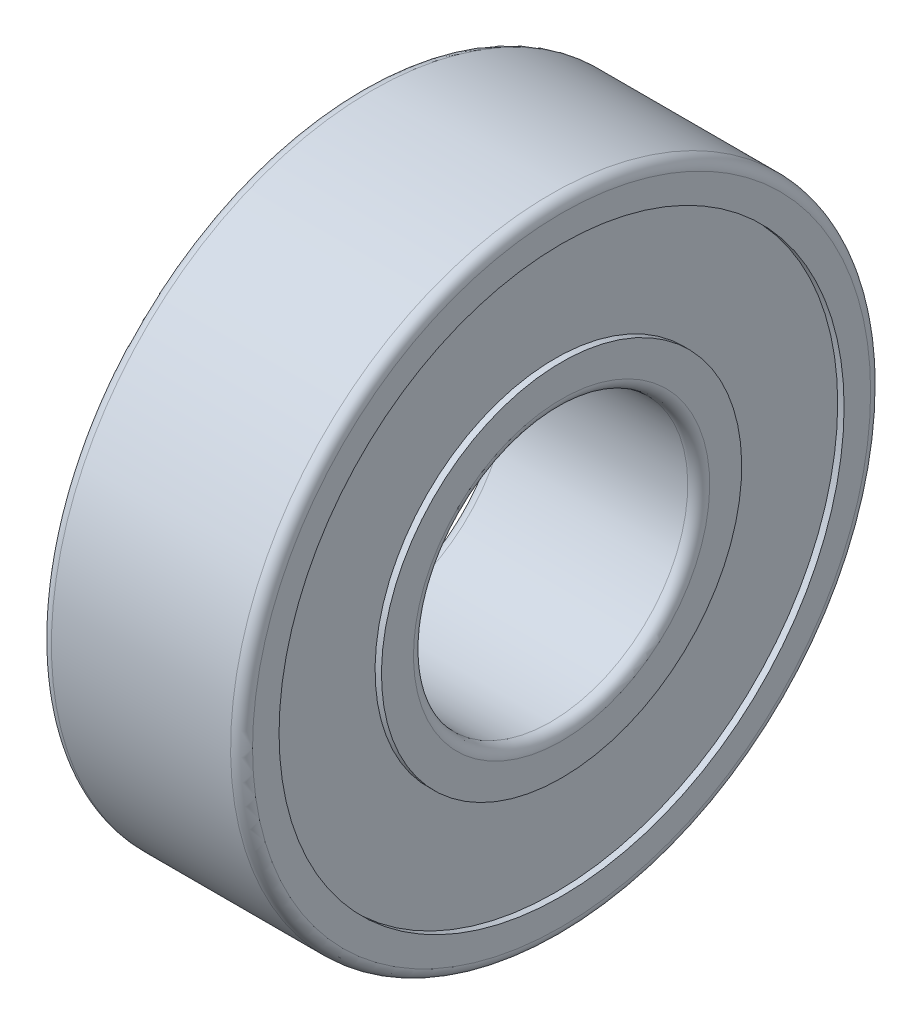
ISO-10303-21;
HEADER;
FILE_DESCRIPTION(('STEP AP214'),'2;1');
FILE_NAME('part.step','',(''),(''),'','','');
FILE_SCHEMA(('AUTOMOTIVE_DESIGN { 1 0 10303 214 1 1 1 1 }'));
ENDSEC;
DATA;
#1=APPLICATION_CONTEXT('core data for automotive mechanical design processes');
#2=APPLICATION_PROTOCOL_DEFINITION('international standard','automotive_design',2000,#1);
#3=PRODUCT_CONTEXT('',#1,'mechanical');
#4=PRODUCT('Part','Part','',(#3));
#5=PRODUCT_RELATED_PRODUCT_CATEGORY('part','',(#4));
#6=PRODUCT_DEFINITION_FORMATION('','',#4);
#7=PRODUCT_DEFINITION_CONTEXT('part definition',#1,'design');
#8=PRODUCT_DEFINITION('design','',#6,#7);
#9=PRODUCT_DEFINITION_SHAPE('','',#8);
#10=(LENGTH_UNIT() NAMED_UNIT(*) SI_UNIT(.MILLI.,.METRE.));
#11=(NAMED_UNIT(*) PLANE_ANGLE_UNIT() SI_UNIT($,.RADIAN.));
#12=(NAMED_UNIT(*) SI_UNIT($,.STERADIAN.) SOLID_ANGLE_UNIT());
#13=UNCERTAINTY_MEASURE_WITH_UNIT(LENGTH_MEASURE(1.E-05),#10,'distance_accuracy_value','');
#14=(GEOMETRIC_REPRESENTATION_CONTEXT(3) GLOBAL_UNCERTAINTY_ASSIGNED_CONTEXT((#13)) GLOBAL_UNIT_ASSIGNED_CONTEXT((#10,
#11,#12)) REPRESENTATION_CONTEXT('',''));
#15=CARTESIAN_POINT('',(0.,0.,0.));
#16=DIRECTION('',(0.,0.,1.));
#17=DIRECTION('',(1.,0.,0.));
#18=AXIS2_PLACEMENT_3D('',#15,#16,#17);
#19=CARTESIAN_POINT('',(0.,15.45,0.));
#20=DIRECTION('',(1.,0.,0.));
#21=DIRECTION('',(0.,1.,0.));
#22=AXIS2_PLACEMENT_3D('',#19,#20,#21);
#23=PLANE('',#22);
#24=CARTESIAN_POINT('',(0.,0.,0.));
#25=DIRECTION('',(1.,0.,0.));
#26=DIRECTION('',(0.,1.,0.));
#27=AXIS2_PLACEMENT_3D('',#24,#25,#26);
#28=CIRCLE('',#27,16.9);
#29=CARTESIAN_POINT('',(0.,16.9,0.));
#30=VERTEX_POINT('',#29);
#31=EDGE_CURVE('E46',#30,#30,#28,.F.);
#32=ORIENTED_EDGE('',*,*,#31,.T.);
#33=EDGE_LOOP('',(#32));
#34=FACE_BOUND('',#33,.T.);
#35=CARTESIAN_POINT('',(0.,0.,0.));
#36=DIRECTION('',(-1.,0.,0.));
#37=DIRECTION('',(0.,-1.,0.));
#38=AXIS2_PLACEMENT_3D('',#35,#36,#37);
#39=CIRCLE('',#38,15.45);
#40=CARTESIAN_POINT('',(0.,-15.45,0.));
#41=VERTEX_POINT('',#40);
#42=EDGE_CURVE('E84',#41,#41,#39,.T.);
#43=ORIENTED_EDGE('',*,*,#42,.F.);
#44=EDGE_LOOP('',(#43));
#45=FACE_BOUND('',#44,.T.);
#46=ADVANCED_FACE('F31',(#34,#45),#23,.F.);
#47=CARTESIAN_POINT('',(0.,0.,0.));
#48=DIRECTION('',(-1.,0.,0.));
#49=DIRECTION('',(0.,-1.,0.));
#50=AXIS2_PLACEMENT_3D('',#47,#48,#49);
#51=CYLINDRICAL_SURFACE('',#50,17.5);
#52=CARTESIAN_POINT('',(0.6,0.,0.));
#53=DIRECTION('',(1.,0.,0.));
#54=DIRECTION('',(0.,1.,0.));
#55=AXIS2_PLACEMENT_3D('',#52,#53,#54);
#56=CIRCLE('',#55,17.5);
#57=CARTESIAN_POINT('',(0.6,17.5,0.));
#58=VERTEX_POINT('',#57);
#59=EDGE_CURVE('E38',#58,#58,#56,.T.);
#60=ORIENTED_EDGE('',*,*,#59,.T.);
#61=EDGE_LOOP('',(#60));
#62=FACE_BOUND('',#61,.T.);
#63=CARTESIAN_POINT('',(10.4,0.,0.));
#64=DIRECTION('',(-1.,0.,0.));
#65=DIRECTION('',(0.,-1.,0.));
#66=AXIS2_PLACEMENT_3D('',#63,#64,#65);
#67=CIRCLE('',#66,17.5);
#68=CARTESIAN_POINT('',(10.4,-17.5,0.));
#69=VERTEX_POINT('',#68);
#70=EDGE_CURVE('E42',#69,#69,#67,.T.);
#71=ORIENTED_EDGE('',*,*,#70,.T.);
#72=EDGE_LOOP('',(#71));
#73=FACE_BOUND('',#72,.T.);
#74=ADVANCED_FACE('F91',(#62,#73),#51,.T.);
#75=CARTESIAN_POINT('',(11.,17.5,0.));
#76=DIRECTION('',(-1.,0.,0.));
#77=DIRECTION('',(0.,-1.,0.));
#78=AXIS2_PLACEMENT_3D('',#75,#76,#77);
#79=PLANE('',#78);
#80=CARTESIAN_POINT('',(11.,0.,0.));
#81=DIRECTION('',(-1.,0.,0.));
#82=DIRECTION('',(0.,-1.,0.));
#83=AXIS2_PLACEMENT_3D('',#80,#81,#82);
#84=CIRCLE('',#83,16.9);
#85=CARTESIAN_POINT('',(11.,-16.9,0.));
#86=VERTEX_POINT('',#85);
#87=EDGE_CURVE('E10',#86,#86,#84,.F.);
#88=ORIENTED_EDGE('',*,*,#87,.T.);
#89=EDGE_LOOP('',(#88));
#90=FACE_BOUND('',#89,.T.);
#91=CARTESIAN_POINT('',(11.,0.,0.));
#92=DIRECTION('',(-1.,0.,0.));
#93=DIRECTION('',(0.,-1.,0.));
#94=AXIS2_PLACEMENT_3D('',#91,#92,#93);
#95=CIRCLE('',#94,15.45);
#96=CARTESIAN_POINT('',(11.,-15.45,0.));
#97=VERTEX_POINT('',#96);
#98=EDGE_CURVE('E63',#97,#97,#95,.T.);
#99=ORIENTED_EDGE('',*,*,#98,.T.);
#100=EDGE_LOOP('',(#99));
#101=FACE_BOUND('',#100,.T.);
#102=ADVANCED_FACE('F97',(#90,#101),#79,.F.);
#103=CARTESIAN_POINT('',(0.,0.,0.));
#104=DIRECTION('',(-1.,0.,0.));
#105=DIRECTION('',(0.,-1.,0.));
#106=AXIS2_PLACEMENT_3D('',#103,#104,#105);
#107=CYLINDRICAL_SURFACE('',#106,15.45);
#108=ORIENTED_EDGE('',*,*,#98,.F.);
#109=EDGE_LOOP('',(#108));
#110=FACE_BOUND('',#109,.T.);
#111=CARTESIAN_POINT('',(10.65,0.,0.));
#112=DIRECTION('',(-1.,0.,0.));
#113=DIRECTION('',(0.,-1.,0.));
#114=AXIS2_PLACEMENT_3D('',#111,#112,#113);
#115=CIRCLE('',#114,15.45);
#116=CARTESIAN_POINT('',(10.65,-15.45,0.));
#117=VERTEX_POINT('',#116);
#118=EDGE_CURVE('E66',#117,#117,#115,.T.);
#119=ORIENTED_EDGE('',*,*,#118,.T.);
#120=EDGE_LOOP('',(#119));
#121=FACE_BOUND('',#120,.T.);
#122=ADVANCED_FACE('F185',(#110,#121),#107,.F.);
#123=CARTESIAN_POINT('',(10.65,15.45,0.));
#124=DIRECTION('',(-1.,0.,0.));
#125=DIRECTION('',(0.,-1.,0.));
#126=AXIS2_PLACEMENT_3D('',#123,#124,#125);
#127=PLANE('',#126);
#128=ORIENTED_EDGE('',*,*,#118,.F.);
#129=EDGE_LOOP('',(#128));
#130=FACE_BOUND('',#129,.T.);
#131=CARTESIAN_POINT('',(10.65,0.,0.));
#132=DIRECTION('',(-1.,0.,0.));
#133=DIRECTION('',(0.,-1.,0.));
#134=AXIS2_PLACEMENT_3D('',#131,#132,#133);
#135=CIRCLE('',#134,9.85);
#136=CARTESIAN_POINT('',(10.65,-9.85,0.));
#137=VERTEX_POINT('',#136);
#138=EDGE_CURVE('E69',#137,#137,#135,.T.);
#139=ORIENTED_EDGE('',*,*,#138,.T.);
#140=EDGE_LOOP('',(#139));
#141=FACE_BOUND('',#140,.T.);
#142=ADVANCED_FACE('F227',(#130,#141),#127,.F.);
#143=CARTESIAN_POINT('',(0.,0.,0.));
#144=DIRECTION('',(-1.,0.,0.));
#145=DIRECTION('',(0.,-1.,0.));
#146=AXIS2_PLACEMENT_3D('',#143,#144,#145);
#147=CYLINDRICAL_SURFACE('',#146,9.85);
#148=ORIENTED_EDGE('',*,*,#138,.F.);
#149=EDGE_LOOP('',(#148));
#150=FACE_BOUND('',#149,.T.);
#151=CARTESIAN_POINT('',(11.,0.,0.));
#152=DIRECTION('',(-1.,0.,0.));
#153=DIRECTION('',(0.,-1.,0.));
#154=AXIS2_PLACEMENT_3D('',#151,#152,#153);
#155=CIRCLE('',#154,9.85);
#156=CARTESIAN_POINT('',(11.,-9.85,0.));
#157=VERTEX_POINT('',#156);
#158=EDGE_CURVE('E72',#157,#157,#155,.T.);
#159=ORIENTED_EDGE('',*,*,#158,.T.);
#160=EDGE_LOOP('',(#159));
#161=FACE_BOUND('',#160,.T.);
#162=ADVANCED_FACE('F173',(#150,#161),#147,.T.);
#163=CARTESIAN_POINT('',(11.,9.85,0.));
#164=DIRECTION('',(-1.,0.,0.));
#165=DIRECTION('',(0.,-1.,0.));
#166=AXIS2_PLACEMENT_3D('',#163,#164,#165);
#167=PLANE('',#166);
#168=CARTESIAN_POINT('',(11.,0.,0.));
#169=DIRECTION('',(-1.,0.,0.));
#170=DIRECTION('',(0.,-1.,0.));
#171=AXIS2_PLACEMENT_3D('',#168,#169,#170);
#172=CIRCLE('',#171,8.1);
#173=CARTESIAN_POINT('',(11.,-8.1,0.));
#174=VERTEX_POINT('',#173);
#175=EDGE_CURVE('E51',#174,#174,#172,.T.);
#176=ORIENTED_EDGE('',*,*,#175,.T.);
#177=EDGE_LOOP('',(#176));
#178=FACE_BOUND('',#177,.T.);
#179=ORIENTED_EDGE('',*,*,#158,.F.);
#180=EDGE_LOOP('',(#179));
#181=FACE_BOUND('',#180,.T.);
#182=ADVANCED_FACE('F163',(#178,#181),#167,.F.);
#183=CARTESIAN_POINT('',(0.,0.,0.));
#184=DIRECTION('',(-1.,0.,0.));
#185=DIRECTION('',(0.,-1.,0.));
#186=AXIS2_PLACEMENT_3D('',#183,#184,#185);
#187=CYLINDRICAL_SURFACE('',#186,7.5);
#188=CARTESIAN_POINT('',(0.6,0.,0.));
#189=DIRECTION('',(1.,0.,0.));
#190=DIRECTION('',(0.,1.,0.));
#191=AXIS2_PLACEMENT_3D('',#188,#189,#190);
#192=CIRCLE('',#191,7.5);
#193=CARTESIAN_POINT('',(0.6,7.5,0.));
#194=VERTEX_POINT('',#193);
#195=EDGE_CURVE('E57',#194,#194,#192,.F.);
#196=ORIENTED_EDGE('',*,*,#195,.T.);
#197=EDGE_LOOP('',(#196));
#198=FACE_BOUND('',#197,.T.);
#199=CARTESIAN_POINT('',(10.4,0.,0.));
#200=DIRECTION('',(-1.,0.,0.));
#201=DIRECTION('',(0.,-1.,0.));
#202=AXIS2_PLACEMENT_3D('',#199,#200,#201);
#203=CIRCLE('',#202,7.5);
#204=CARTESIAN_POINT('',(10.4,-7.5,0.));
#205=VERTEX_POINT('',#204);
#206=EDGE_CURVE('E60',#205,#205,#203,.F.);
#207=ORIENTED_EDGE('',*,*,#206,.T.);
#208=EDGE_LOOP('',(#207));
#209=FACE_BOUND('',#208,.T.);
#210=ADVANCED_FACE('F151',(#198,#209),#187,.F.);
#211=CARTESIAN_POINT('',(0.,7.5,0.));
#212=DIRECTION('',(1.,0.,0.));
#213=DIRECTION('',(0.,1.,0.));
#214=AXIS2_PLACEMENT_3D('',#211,#212,#213);
#215=PLANE('',#214);
#216=CARTESIAN_POINT('',(0.,0.,0.));
#217=DIRECTION('',(1.,0.,0.));
#218=DIRECTION('',(0.,1.,0.));
#219=AXIS2_PLACEMENT_3D('',#216,#217,#218);
#220=CIRCLE('',#219,8.1);
#221=CARTESIAN_POINT('',(0.,8.1,0.));
#222=VERTEX_POINT('',#221);
#223=EDGE_CURVE('E54',#222,#222,#220,.T.);
#224=ORIENTED_EDGE('',*,*,#223,.T.);
#225=EDGE_LOOP('',(#224));
#226=FACE_BOUND('',#225,.T.);
#227=CARTESIAN_POINT('',(0.,0.,0.));
#228=DIRECTION('',(-1.,0.,0.));
#229=DIRECTION('',(0.,-1.,0.));
#230=AXIS2_PLACEMENT_3D('',#227,#228,#229);
#231=CIRCLE('',#230,9.85);
#232=CARTESIAN_POINT('',(0.,-9.85,0.));
#233=VERTEX_POINT('',#232);
#234=EDGE_CURVE('E75',#233,#233,#231,.T.);
#235=ORIENTED_EDGE('',*,*,#234,.T.);
#236=EDGE_LOOP('',(#235));
#237=FACE_BOUND('',#236,.T.);
#238=ADVANCED_FACE('F145',(#226,#237),#215,.F.);
#239=CARTESIAN_POINT('',(0.,0.,0.));
#240=DIRECTION('',(-1.,0.,0.));
#241=DIRECTION('',(0.,-1.,0.));
#242=AXIS2_PLACEMENT_3D('',#239,#240,#241);
#243=CYLINDRICAL_SURFACE('',#242,9.85);
#244=ORIENTED_EDGE('',*,*,#234,.F.);
#245=EDGE_LOOP('',(#244));
#246=FACE_BOUND('',#245,.T.);
#247=CARTESIAN_POINT('',(0.349999999999999,0.,0.));
#248=DIRECTION('',(-1.,0.,0.));
#249=DIRECTION('',(0.,-1.,0.));
#250=AXIS2_PLACEMENT_3D('',#247,#248,#249);
#251=CIRCLE('',#250,9.85);
#252=CARTESIAN_POINT('',(0.349999999999999,-9.85,0.));
#253=VERTEX_POINT('',#252);
#254=EDGE_CURVE('E78',#253,#253,#251,.T.);
#255=ORIENTED_EDGE('',*,*,#254,.T.);
#256=EDGE_LOOP('',(#255));
#257=FACE_BOUND('',#256,.T.);
#258=ADVANCED_FACE('F150',(#246,#257),#243,.T.);
#259=CARTESIAN_POINT('',(0.349999999999999,9.85,0.));
#260=DIRECTION('',(1.,0.,0.));
#261=DIRECTION('',(0.,1.,0.));
#262=AXIS2_PLACEMENT_3D('',#259,#260,#261);
#263=PLANE('',#262);
#264=ORIENTED_EDGE('',*,*,#254,.F.);
#265=EDGE_LOOP('',(#264));
#266=FACE_BOUND('',#265,.T.);
#267=CARTESIAN_POINT('',(0.349999999999999,0.,0.));
#268=DIRECTION('',(-1.,0.,0.));
#269=DIRECTION('',(0.,-1.,0.));
#270=AXIS2_PLACEMENT_3D('',#267,#268,#269);
#271=CIRCLE('',#270,15.45);
#272=CARTESIAN_POINT('',(0.349999999999999,-15.45,0.));
#273=VERTEX_POINT('',#272);
#274=EDGE_CURVE('E81',#273,#273,#271,.T.);
#275=ORIENTED_EDGE('',*,*,#274,.T.);
#276=EDGE_LOOP('',(#275));
#277=FACE_BOUND('',#276,.T.);
#278=ADVANCED_FACE('F203',(#266,#277),#263,.F.);
#279=CARTESIAN_POINT('',(0.,0.,0.));
#280=DIRECTION('',(-1.,0.,0.));
#281=DIRECTION('',(0.,-1.,0.));
#282=AXIS2_PLACEMENT_3D('',#279,#280,#281);
#283=CYLINDRICAL_SURFACE('',#282,15.45);
#284=ORIENTED_EDGE('',*,*,#274,.F.);
#285=EDGE_LOOP('',(#284));
#286=FACE_BOUND('',#285,.T.);
#287=ORIENTED_EDGE('',*,*,#42,.T.);
#288=EDGE_LOOP('',(#287));
#289=FACE_BOUND('',#288,.T.);
#290=ADVANCED_FACE('F88',(#286,#289),#283,.F.);
#291=CARTESIAN_POINT('',(0.6,0.,0.));
#292=DIRECTION('',(1.,0.,0.));
#293=DIRECTION('',(0.,1.,0.));
#294=AXIS2_PLACEMENT_3D('',#291,#292,#293);
#295=TOROIDAL_SURFACE('',#294,8.1,0.6);
#296=ORIENTED_EDGE('',*,*,#223,.F.);
#297=EDGE_LOOP('',(#296));
#298=FACE_BOUND('',#297,.T.);
#299=ORIENTED_EDGE('',*,*,#195,.F.);
#300=EDGE_LOOP('',(#299));
#301=FACE_BOUND('',#300,.T.);
#302=ADVANCED_FACE('F101',(#298,#301),#295,.T.);
#303=CARTESIAN_POINT('',(10.4,0.,0.));
#304=DIRECTION('',(-1.,0.,0.));
#305=DIRECTION('',(0.,-1.,0.));
#306=AXIS2_PLACEMENT_3D('',#303,#304,#305);
#307=TOROIDAL_SURFACE('',#306,8.1,0.6);
#308=ORIENTED_EDGE('',*,*,#206,.F.);
#309=EDGE_LOOP('',(#308));
#310=FACE_BOUND('',#309,.T.);
#311=ORIENTED_EDGE('',*,*,#175,.F.);
#312=EDGE_LOOP('',(#311));
#313=FACE_BOUND('',#312,.T.);
#314=ADVANCED_FACE('F104',(#310,#313),#307,.T.);
#315=CARTESIAN_POINT('',(0.6,0.,0.));
#316=DIRECTION('',(1.,0.,0.));
#317=DIRECTION('',(0.,1.,0.));
#318=AXIS2_PLACEMENT_3D('',#315,#316,#317);
#319=TOROIDAL_SURFACE('',#318,16.9,0.6);
#320=ORIENTED_EDGE('',*,*,#59,.F.);
#321=EDGE_LOOP('',(#320));
#322=FACE_BOUND('',#321,.T.);
#323=ORIENTED_EDGE('',*,*,#31,.F.);
#324=EDGE_LOOP('',(#323));
#325=FACE_BOUND('',#324,.T.);
#326=ADVANCED_FACE('F107',(#322,#325),#319,.T.);
#327=CARTESIAN_POINT('',(10.4,0.,0.));
#328=DIRECTION('',(-1.,0.,0.));
#329=DIRECTION('',(0.,-1.,0.));
#330=AXIS2_PLACEMENT_3D('',#327,#328,#329);
#331=TOROIDAL_SURFACE('',#330,16.9,0.6);
#332=ORIENTED_EDGE('',*,*,#87,.F.);
#333=EDGE_LOOP('',(#332));
#334=FACE_BOUND('',#333,.T.);
#335=ORIENTED_EDGE('',*,*,#70,.F.);
#336=EDGE_LOOP('',(#335));
#337=FACE_BOUND('',#336,.T.);
#338=ADVANCED_FACE('F33',(#334,#337),#331,.T.);
#339=CLOSED_SHELL('',(#46,#74,#102,#122,#142,#162,#182,#210,#238,#258,#278,#290,#302,#314,#326,#338));
#340=MANIFOLD_SOLID_BREP('B2',#339);
#341=ADVANCED_BREP_SHAPE_REPRESENTATION('',(#18,#340),#14);
#342=SHAPE_DEFINITION_REPRESENTATION(#9,#341);
ENDSEC;
END-ISO-10303-21;
